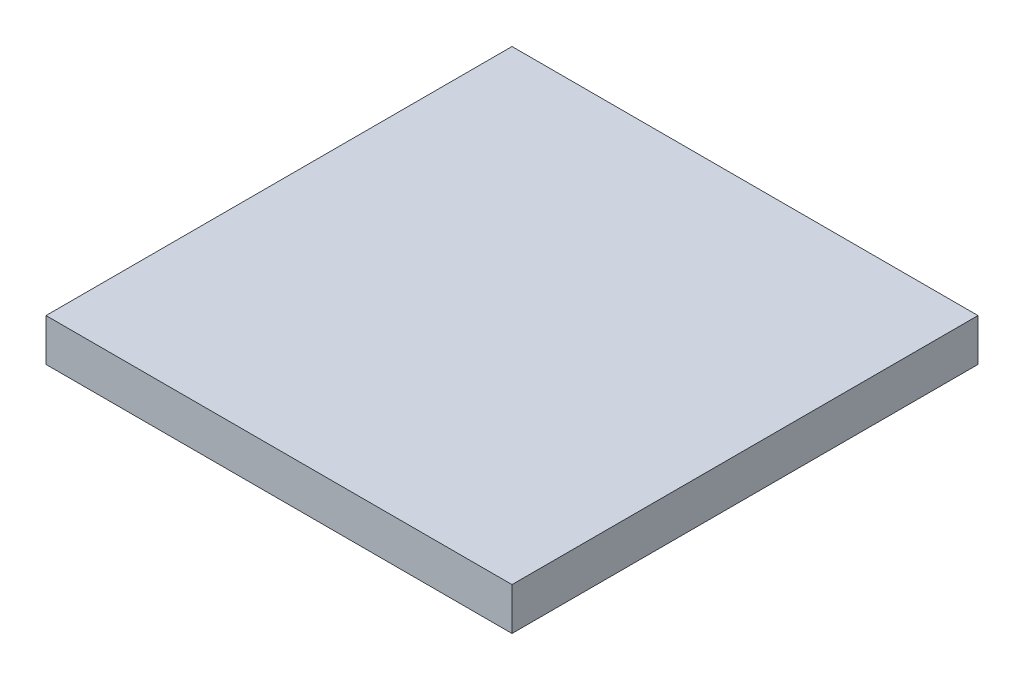
ISO-10303-21;
HEADER;
FILE_DESCRIPTION(('STEP AP214'),'2;1');
FILE_NAME('part.step','',(''),(''),'','','');
FILE_SCHEMA(('AUTOMOTIVE_DESIGN { 1 0 10303 214 1 1 1 1 }'));
ENDSEC;
DATA;
#1=APPLICATION_CONTEXT('core data for automotive mechanical design processes');
#2=APPLICATION_PROTOCOL_DEFINITION('international standard','automotive_design',2000,#1);
#3=PRODUCT_CONTEXT('',#1,'mechanical');
#4=PRODUCT('Part','Part','',(#3));
#5=PRODUCT_RELATED_PRODUCT_CATEGORY('part','',(#4));
#6=PRODUCT_DEFINITION_FORMATION('','',#4);
#7=PRODUCT_DEFINITION_CONTEXT('part definition',#1,'design');
#8=PRODUCT_DEFINITION('design','',#6,#7);
#9=PRODUCT_DEFINITION_SHAPE('','',#8);
#10=(LENGTH_UNIT() NAMED_UNIT(*) SI_UNIT(.MILLI.,.METRE.));
#11=(NAMED_UNIT(*) PLANE_ANGLE_UNIT() SI_UNIT($,.RADIAN.));
#12=(NAMED_UNIT(*) SI_UNIT($,.STERADIAN.) SOLID_ANGLE_UNIT());
#13=UNCERTAINTY_MEASURE_WITH_UNIT(LENGTH_MEASURE(1.E-05),#10,'distance_accuracy_value','');
#14=(GEOMETRIC_REPRESENTATION_CONTEXT(3) GLOBAL_UNCERTAINTY_ASSIGNED_CONTEXT((#13)) GLOBAL_UNIT_ASSIGNED_CONTEXT((#10,
#11,#12)) REPRESENTATION_CONTEXT('',''));
#15=CARTESIAN_POINT('',(0.,0.,0.));
#16=DIRECTION('',(0.,0.,1.));
#17=DIRECTION('',(1.,0.,0.));
#18=AXIS2_PLACEMENT_3D('',#15,#16,#17);
#19=CARTESIAN_POINT('',(0.,-1.,0.));
#20=DIRECTION('',(0.,1.,0.));
#21=DIRECTION('',(0.,0.,1.));
#22=AXIS2_PLACEMENT_3D('',#19,#20,#21);
#23=PLANE('',#22);
#24=DIRECTION('',(0.,0.,-1.));
#25=VECTOR('',#24,1.);
#26=CARTESIAN_POINT('',(11.,-1.,-11.));
#27=LINE('',#26,#25);
#28=CARTESIAN_POINT('',(11.,-1.,11.));
#29=VERTEX_POINT('',#28);
#30=CARTESIAN_POINT('',(11.,-1.,-11.));
#31=VERTEX_POINT('',#30);
#32=EDGE_CURVE('E143',#29,#31,#27,.T.);
#33=ORIENTED_EDGE('',*,*,#32,.F.);
#34=DIRECTION('',(1.,0.,0.));
#35=VECTOR('',#34,1.);
#36=CARTESIAN_POINT('',(-11.,-1.,11.));
#37=LINE('',#36,#35);
#38=CARTESIAN_POINT('',(-11.,-1.,11.));
#39=VERTEX_POINT('',#38);
#40=EDGE_CURVE('E156',#39,#29,#37,.T.);
#41=ORIENTED_EDGE('',*,*,#40,.F.);
#42=DIRECTION('',(0.,0.,1.));
#43=VECTOR('',#42,1.);
#44=CARTESIAN_POINT('',(-11.,-1.,-11.));
#45=LINE('',#44,#43);
#46=CARTESIAN_POINT('',(-11.,-1.,-11.));
#47=VERTEX_POINT('',#46);
#48=EDGE_CURVE('E164',#47,#39,#45,.T.);
#49=ORIENTED_EDGE('',*,*,#48,.F.);
#50=DIRECTION('',(-1.,0.,0.));
#51=VECTOR('',#50,1.);
#52=CARTESIAN_POINT('',(-11.,-1.,-11.));
#53=LINE('',#52,#51);
#54=EDGE_CURVE('E146',#31,#47,#53,.T.);
#55=ORIENTED_EDGE('',*,*,#54,.F.);
#56=EDGE_LOOP('',(#33,#41,#49,#55));
#57=FACE_BOUND('',#56,.T.);
#58=DIRECTION('',(-1.,0.,0.));
#59=VECTOR('',#58,1.);
#60=CARTESIAN_POINT('',(7.25,-1.,8.75));
#61=LINE('',#60,#59);
#62=CARTESIAN_POINT('',(8.75,-1.,8.75));
#63=VERTEX_POINT('',#62);
#64=CARTESIAN_POINT('',(7.25,-1.,8.75));
#65=VERTEX_POINT('',#64);
#66=EDGE_CURVE('E142',#63,#65,#61,.T.);
#67=ORIENTED_EDGE('',*,*,#66,.F.);
#68=DIRECTION('',(0.,0.,1.));
#69=VECTOR('',#68,1.);
#70=CARTESIAN_POINT('',(8.75,-1.,-8.75));
#71=LINE('',#70,#69);
#72=CARTESIAN_POINT('',(8.75,-1.,-8.74999999999999));
#73=VERTEX_POINT('',#72);
#74=EDGE_CURVE('E139',#73,#63,#71,.T.);
#75=ORIENTED_EDGE('',*,*,#74,.F.);
#76=DIRECTION('',(1.,0.,0.));
#77=VECTOR('',#76,1.);
#78=CARTESIAN_POINT('',(-8.75,-1.,-8.75));
#79=LINE('',#78,#77);
#80=CARTESIAN_POINT('',(-8.75,-1.,-8.75));
#81=VERTEX_POINT('',#80);
#82=EDGE_CURVE('E337',#81,#73,#79,.T.);
#83=ORIENTED_EDGE('',*,*,#82,.F.);
#84=DIRECTION('',(0.,0.,-1.));
#85=VECTOR('',#84,1.);
#86=CARTESIAN_POINT('',(-8.75,-1.,-8.75));
#87=LINE('',#86,#85);
#88=CARTESIAN_POINT('',(-8.75,-1.,8.75));
#89=VERTEX_POINT('',#88);
#90=EDGE_CURVE('E368',#89,#81,#87,.T.);
#91=ORIENTED_EDGE('',*,*,#90,.F.);
#92=DIRECTION('',(-1.,0.,0.));
#93=VECTOR('',#92,1.);
#94=CARTESIAN_POINT('',(-8.75,-1.,8.75));
#95=LINE('',#94,#93);
#96=CARTESIAN_POINT('',(-7.25,-1.,8.75));
#97=VERTEX_POINT('',#96);
#98=EDGE_CURVE('E361',#97,#89,#95,.T.);
#99=ORIENTED_EDGE('',*,*,#98,.F.);
#100=DIRECTION('',(0.,0.,1.));
#101=VECTOR('',#100,1.);
#102=CARTESIAN_POINT('',(-7.25,-1.,7.25));
#103=LINE('',#102,#101);
#104=CARTESIAN_POINT('',(-7.24999999999999,-1.,-7.25));
#105=VERTEX_POINT('',#104);
#106=EDGE_CURVE('E358',#105,#97,#103,.T.);
#107=ORIENTED_EDGE('',*,*,#106,.F.);
#108=DIRECTION('',(-1.,0.,0.));
#109=VECTOR('',#108,1.);
#110=CARTESIAN_POINT('',(-7.25,-1.,-7.25));
#111=LINE('',#110,#109);
#112=CARTESIAN_POINT('',(7.25,-1.,-7.25));
#113=VERTEX_POINT('',#112);
#114=EDGE_CURVE('E53',#113,#105,#111,.T.);
#115=ORIENTED_EDGE('',*,*,#114,.F.);
#116=DIRECTION('',(0.,0.,-1.));
#117=VECTOR('',#116,1.);
#118=CARTESIAN_POINT('',(7.25,-1.,-7.25));
#119=LINE('',#118,#117);
#120=EDGE_CURVE('E48',#65,#113,#119,.T.);
#121=ORIENTED_EDGE('',*,*,#120,.F.);
#122=EDGE_LOOP('',(#67,#75,#83,#91,#99,#107,#115,#121));
#123=FACE_BOUND('',#122,.T.);
#124=ADVANCED_FACE('F33',(#57,#123),#23,.F.);
#125=CARTESIAN_POINT('',(11.,1.,-11.));
#126=DIRECTION('',(-1.,0.,0.));
#127=DIRECTION('',(0.,0.,1.));
#128=AXIS2_PLACEMENT_3D('',#125,#126,#127);
#129=PLANE('',#128);
#130=ORIENTED_EDGE('',*,*,#32,.T.);
#131=DIRECTION('',(0.,-1.,0.));
#132=VECTOR('',#131,1.);
#133=CARTESIAN_POINT('',(11.,1.,-11.));
#134=LINE('',#133,#132);
#135=CARTESIAN_POINT('',(11.,1.,-11.));
#136=VERTEX_POINT('',#135);
#137=EDGE_CURVE('E11',#136,#31,#134,.T.);
#138=ORIENTED_EDGE('',*,*,#137,.F.);
#139=DIRECTION('',(0.,0.,-1.));
#140=VECTOR('',#139,1.);
#141=CARTESIAN_POINT('',(11.,1.,-11.));
#142=LINE('',#141,#140);
#143=CARTESIAN_POINT('',(11.,1.,11.));
#144=VERTEX_POINT('',#143);
#145=EDGE_CURVE('E152',#144,#136,#142,.T.);
#146=ORIENTED_EDGE('',*,*,#145,.F.);
#147=DIRECTION('',(0.,-1.,0.));
#148=VECTOR('',#147,1.);
#149=CARTESIAN_POINT('',(11.,1.,11.));
#150=LINE('',#149,#148);
#151=EDGE_CURVE('E161',#144,#29,#150,.T.);
#152=ORIENTED_EDGE('',*,*,#151,.T.);
#153=EDGE_LOOP('',(#130,#138,#146,#152));
#154=FACE_BOUND('',#153,.T.);
#155=ADVANCED_FACE('F35',(#154),#129,.F.);
#156=CARTESIAN_POINT('',(-11.,1.,-11.));
#157=DIRECTION('',(0.,0.,1.));
#158=DIRECTION('',(1.,0.,0.));
#159=AXIS2_PLACEMENT_3D('',#156,#157,#158);
#160=PLANE('',#159);
#161=ORIENTED_EDGE('',*,*,#54,.T.);
#162=DIRECTION('',(0.,-1.,0.));
#163=VECTOR('',#162,1.);
#164=CARTESIAN_POINT('',(-11.,1.,-11.));
#165=LINE('',#164,#163);
#166=CARTESIAN_POINT('',(-11.,1.,-11.));
#167=VERTEX_POINT('',#166);
#168=EDGE_CURVE('E41',#167,#47,#165,.T.);
#169=ORIENTED_EDGE('',*,*,#168,.F.);
#170=DIRECTION('',(-1.,0.,0.));
#171=VECTOR('',#170,1.);
#172=CARTESIAN_POINT('',(-11.,1.,-11.));
#173=LINE('',#172,#171);
#174=EDGE_CURVE('E155',#136,#167,#173,.T.);
#175=ORIENTED_EDGE('',*,*,#174,.F.);
#176=ORIENTED_EDGE('',*,*,#137,.T.);
#177=EDGE_LOOP('',(#161,#169,#175,#176));
#178=FACE_BOUND('',#177,.T.);
#179=ADVANCED_FACE('F191',(#178),#160,.F.);
#180=CARTESIAN_POINT('',(-11.,1.,-11.));
#181=DIRECTION('',(1.,0.,0.));
#182=DIRECTION('',(0.,0.,-1.));
#183=AXIS2_PLACEMENT_3D('',#180,#181,#182);
#184=PLANE('',#183);
#185=ORIENTED_EDGE('',*,*,#48,.T.);
#186=DIRECTION('',(0.,-1.,0.));
#187=VECTOR('',#186,1.);
#188=CARTESIAN_POINT('',(-11.,1.,11.));
#189=LINE('',#188,#187);
#190=CARTESIAN_POINT('',(-11.,1.,11.));
#191=VERTEX_POINT('',#190);
#192=EDGE_CURVE('E169',#191,#39,#189,.T.);
#193=ORIENTED_EDGE('',*,*,#192,.F.);
#194=DIRECTION('',(0.,0.,1.));
#195=VECTOR('',#194,1.);
#196=CARTESIAN_POINT('',(-11.,1.,-11.));
#197=LINE('',#196,#195);
#198=EDGE_CURVE('E158',#167,#191,#197,.T.);
#199=ORIENTED_EDGE('',*,*,#198,.F.);
#200=ORIENTED_EDGE('',*,*,#168,.T.);
#201=EDGE_LOOP('',(#185,#193,#199,#200));
#202=FACE_BOUND('',#201,.T.);
#203=ADVANCED_FACE('F176',(#202),#184,.F.);
#204=CARTESIAN_POINT('',(-11.,1.,11.));
#205=DIRECTION('',(0.,0.,-1.));
#206=DIRECTION('',(-1.,0.,0.));
#207=AXIS2_PLACEMENT_3D('',#204,#205,#206);
#208=PLANE('',#207);
#209=ORIENTED_EDGE('',*,*,#40,.T.);
#210=ORIENTED_EDGE('',*,*,#151,.F.);
#211=DIRECTION('',(1.,0.,0.));
#212=VECTOR('',#211,1.);
#213=CARTESIAN_POINT('',(-11.,1.,11.));
#214=LINE('',#213,#212);
#215=EDGE_CURVE('E160',#191,#144,#214,.T.);
#216=ORIENTED_EDGE('',*,*,#215,.F.);
#217=ORIENTED_EDGE('',*,*,#192,.T.);
#218=EDGE_LOOP('',(#209,#210,#216,#217));
#219=FACE_BOUND('',#218,.T.);
#220=ADVANCED_FACE('F184',(#219),#208,.F.);
#221=CARTESIAN_POINT('',(0.,1.,0.));
#222=DIRECTION('',(0.,1.,0.));
#223=DIRECTION('',(0.,0.,1.));
#224=AXIS2_PLACEMENT_3D('',#221,#222,#223);
#225=PLANE('',#224);
#226=ORIENTED_EDGE('',*,*,#145,.T.);
#227=ORIENTED_EDGE('',*,*,#174,.T.);
#228=ORIENTED_EDGE('',*,*,#198,.T.);
#229=ORIENTED_EDGE('',*,*,#215,.T.);
#230=EDGE_LOOP('',(#226,#227,#228,#229));
#231=FACE_BOUND('',#230,.T.);
#232=ADVANCED_FACE('F190',(#231),#225,.T.);
#233=CARTESIAN_POINT('',(7.25,-3.,8.75));
#234=DIRECTION('',(0.,0.,-1.));
#235=DIRECTION('',(-1.,0.,0.));
#236=AXIS2_PLACEMENT_3D('',#233,#234,#235);
#237=PLANE('',#236);
#238=ORIENTED_EDGE('',*,*,#66,.T.);
#239=DIRECTION('',(0.,1.,0.));
#240=VECTOR('',#239,1.);
#241=CARTESIAN_POINT('',(7.25,-3.,8.75));
#242=LINE('',#241,#240);
#243=CARTESIAN_POINT('',(7.25,-3.,8.75));
#244=VERTEX_POINT('',#243);
#245=EDGE_CURVE('E123',#244,#65,#242,.T.);
#246=ORIENTED_EDGE('',*,*,#245,.F.);
#247=DIRECTION('',(-1.,0.,0.));
#248=VECTOR('',#247,1.);
#249=CARTESIAN_POINT('',(7.25,-3.,8.75));
#250=LINE('',#249,#248);
#251=CARTESIAN_POINT('',(8.75,-3.,8.75));
#252=VERTEX_POINT('',#251);
#253=EDGE_CURVE('E130',#252,#244,#250,.T.);
#254=ORIENTED_EDGE('',*,*,#253,.F.);
#255=DIRECTION('',(0.,1.,0.));
#256=VECTOR('',#255,1.);
#257=CARTESIAN_POINT('',(8.75,-3.,8.75));
#258=LINE('',#257,#256);
#259=EDGE_CURVE('E333',#252,#63,#258,.T.);
#260=ORIENTED_EDGE('',*,*,#259,.T.);
#261=EDGE_LOOP('',(#238,#246,#254,#260));
#262=FACE_BOUND('',#261,.T.);
#263=ADVANCED_FACE('F141',(#262),#237,.F.);
#264=CARTESIAN_POINT('',(7.25,-3.,-7.25));
#265=DIRECTION('',(1.,0.,0.));
#266=DIRECTION('',(0.,0.,-1.));
#267=AXIS2_PLACEMENT_3D('',#264,#265,#266);
#268=PLANE('',#267);
#269=ORIENTED_EDGE('',*,*,#120,.T.);
#270=DIRECTION('',(0.,1.,0.));
#271=VECTOR('',#270,1.);
#272=CARTESIAN_POINT('',(7.25,-3.,-7.25));
#273=LINE('',#272,#271);
#274=CARTESIAN_POINT('',(7.25,-3.,-7.25));
#275=VERTEX_POINT('',#274);
#276=EDGE_CURVE('E126',#275,#113,#273,.T.);
#277=ORIENTED_EDGE('',*,*,#276,.F.);
#278=DIRECTION('',(0.,0.,-1.));
#279=VECTOR('',#278,1.);
#280=CARTESIAN_POINT('',(7.25,-3.,7.25));
#281=LINE('',#280,#279);
#282=EDGE_CURVE('E119',#244,#275,#281,.T.);
#283=ORIENTED_EDGE('',*,*,#282,.F.);
#284=ORIENTED_EDGE('',*,*,#245,.T.);
#285=EDGE_LOOP('',(#269,#277,#283,#284));
#286=FACE_BOUND('',#285,.T.);
#287=ADVANCED_FACE('F121',(#286),#268,.F.);
#288=CARTESIAN_POINT('',(-7.25,-3.,-7.25));
#289=DIRECTION('',(0.,0.,-1.));
#290=DIRECTION('',(-1.,0.,0.));
#291=AXIS2_PLACEMENT_3D('',#288,#289,#290);
#292=PLANE('',#291);
#293=ORIENTED_EDGE('',*,*,#114,.T.);
#294=DIRECTION('',(0.,1.,0.));
#295=VECTOR('',#294,1.);
#296=CARTESIAN_POINT('',(-7.25,-3.,-7.25));
#297=LINE('',#296,#295);
#298=CARTESIAN_POINT('',(-7.25,-3.,-7.25));
#299=VERTEX_POINT('',#298);
#300=EDGE_CURVE('E148',#299,#105,#297,.T.);
#301=ORIENTED_EDGE('',*,*,#300,.F.);
#302=DIRECTION('',(-1.,0.,0.));
#303=VECTOR('',#302,1.);
#304=CARTESIAN_POINT('',(-7.25,-3.,-7.25));
#305=LINE('',#304,#303);
#306=EDGE_CURVE('E129',#275,#299,#305,.T.);
#307=ORIENTED_EDGE('',*,*,#306,.F.);
#308=ORIENTED_EDGE('',*,*,#276,.T.);
#309=EDGE_LOOP('',(#293,#301,#307,#308));
#310=FACE_BOUND('',#309,.T.);
#311=ADVANCED_FACE('F215',(#310),#292,.F.);
#312=CARTESIAN_POINT('',(-7.25,-3.,7.25));
#313=DIRECTION('',(-1.,0.,0.));
#314=DIRECTION('',(0.,0.,1.));
#315=AXIS2_PLACEMENT_3D('',#312,#313,#314);
#316=PLANE('',#315);
#317=ORIENTED_EDGE('',*,*,#106,.T.);
#318=DIRECTION('',(0.,1.,0.));
#319=VECTOR('',#318,1.);
#320=CARTESIAN_POINT('',(-7.25,-3.,8.75));
#321=LINE('',#320,#319);
#322=CARTESIAN_POINT('',(-7.25,-3.,8.75));
#323=VERTEX_POINT('',#322);
#324=EDGE_CURVE('E351',#323,#97,#321,.T.);
#325=ORIENTED_EDGE('',*,*,#324,.F.);
#326=DIRECTION('',(0.,0.,1.));
#327=VECTOR('',#326,1.);
#328=CARTESIAN_POINT('',(-7.25,-3.,-7.25));
#329=LINE('',#328,#327);
#330=EDGE_CURVE('E359',#299,#323,#329,.T.);
#331=ORIENTED_EDGE('',*,*,#330,.F.);
#332=ORIENTED_EDGE('',*,*,#300,.T.);
#333=EDGE_LOOP('',(#317,#325,#331,#332));
#334=FACE_BOUND('',#333,.T.);
#335=ADVANCED_FACE('F220',(#334),#316,.F.);
#336=CARTESIAN_POINT('',(-8.75,-3.,8.75));
#337=DIRECTION('',(0.,0.,-1.));
#338=DIRECTION('',(-1.,0.,0.));
#339=AXIS2_PLACEMENT_3D('',#336,#337,#338);
#340=PLANE('',#339);
#341=ORIENTED_EDGE('',*,*,#98,.T.);
#342=DIRECTION('',(0.,1.,0.));
#343=VECTOR('',#342,1.);
#344=CARTESIAN_POINT('',(-8.75,-3.,8.75));
#345=LINE('',#344,#343);
#346=CARTESIAN_POINT('',(-8.75,-3.,8.75));
#347=VERTEX_POINT('',#346);
#348=EDGE_CURVE('E348',#347,#89,#345,.T.);
#349=ORIENTED_EDGE('',*,*,#348,.F.);
#350=DIRECTION('',(-1.,0.,0.));
#351=VECTOR('',#350,1.);
#352=CARTESIAN_POINT('',(-8.75,-3.,8.75));
#353=LINE('',#352,#351);
#354=EDGE_CURVE('E376',#323,#347,#353,.T.);
#355=ORIENTED_EDGE('',*,*,#354,.F.);
#356=ORIENTED_EDGE('',*,*,#324,.T.);
#357=EDGE_LOOP('',(#341,#349,#355,#356));
#358=FACE_BOUND('',#357,.T.);
#359=ADVANCED_FACE('F224',(#358),#340,.F.);
#360=CARTESIAN_POINT('',(-8.75,-3.,-8.75));
#361=DIRECTION('',(1.,0.,0.));
#362=DIRECTION('',(0.,0.,-1.));
#363=AXIS2_PLACEMENT_3D('',#360,#361,#362);
#364=PLANE('',#363);
#365=ORIENTED_EDGE('',*,*,#90,.T.);
#366=DIRECTION('',(0.,1.,0.));
#367=VECTOR('',#366,1.);
#368=CARTESIAN_POINT('',(-8.75,-3.,-8.75));
#369=LINE('',#368,#367);
#370=CARTESIAN_POINT('',(-8.75,-3.,-8.75));
#371=VERTEX_POINT('',#370);
#372=EDGE_CURVE('E340',#371,#81,#369,.T.);
#373=ORIENTED_EDGE('',*,*,#372,.F.);
#374=DIRECTION('',(0.,0.,-1.));
#375=VECTOR('',#374,1.);
#376=CARTESIAN_POINT('',(-8.75,-3.,-8.75));
#377=LINE('',#376,#375);
#378=EDGE_CURVE('E374',#347,#371,#377,.T.);
#379=ORIENTED_EDGE('',*,*,#378,.F.);
#380=ORIENTED_EDGE('',*,*,#348,.T.);
#381=EDGE_LOOP('',(#365,#373,#379,#380));
#382=FACE_BOUND('',#381,.T.);
#383=ADVANCED_FACE('F228',(#382),#364,.F.);
#384=CARTESIAN_POINT('',(-8.75,-3.,-8.75));
#385=DIRECTION('',(0.,0.,1.));
#386=DIRECTION('',(1.,0.,0.));
#387=AXIS2_PLACEMENT_3D('',#384,#385,#386);
#388=PLANE('',#387);
#389=ORIENTED_EDGE('',*,*,#82,.T.);
#390=DIRECTION('',(0.,1.,0.));
#391=VECTOR('',#390,1.);
#392=CARTESIAN_POINT('',(8.75,-3.,-8.75));
#393=LINE('',#392,#391);
#394=CARTESIAN_POINT('',(8.75,-3.,-8.75));
#395=VERTEX_POINT('',#394);
#396=EDGE_CURVE('E335',#395,#73,#393,.T.);
#397=ORIENTED_EDGE('',*,*,#396,.F.);
#398=DIRECTION('',(1.,0.,0.));
#399=VECTOR('',#398,1.);
#400=CARTESIAN_POINT('',(-8.75,-3.,-8.75));
#401=LINE('',#400,#399);
#402=EDGE_CURVE('E342',#371,#395,#401,.T.);
#403=ORIENTED_EDGE('',*,*,#402,.F.);
#404=ORIENTED_EDGE('',*,*,#372,.T.);
#405=EDGE_LOOP('',(#389,#397,#403,#404));
#406=FACE_BOUND('',#405,.T.);
#407=ADVANCED_FACE('F232',(#406),#388,.F.);
#408=CARTESIAN_POINT('',(8.75,-3.,-8.75));
#409=DIRECTION('',(-1.,0.,0.));
#410=DIRECTION('',(0.,0.,1.));
#411=AXIS2_PLACEMENT_3D('',#408,#409,#410);
#412=PLANE('',#411);
#413=ORIENTED_EDGE('',*,*,#74,.T.);
#414=ORIENTED_EDGE('',*,*,#259,.F.);
#415=DIRECTION('',(0.,0.,1.));
#416=VECTOR('',#415,1.);
#417=CARTESIAN_POINT('',(8.75,-3.,-8.75));
#418=LINE('',#417,#416);
#419=EDGE_CURVE('E135',#395,#252,#418,.T.);
#420=ORIENTED_EDGE('',*,*,#419,.F.);
#421=ORIENTED_EDGE('',*,*,#396,.T.);
#422=EDGE_LOOP('',(#413,#414,#420,#421));
#423=FACE_BOUND('',#422,.T.);
#424=ADVANCED_FACE('F236',(#423),#412,.F.);
#425=CARTESIAN_POINT('',(0.,-3.,0.));
#426=DIRECTION('',(0.,-1.,0.));
#427=DIRECTION('',(0.,0.,-1.));
#428=AXIS2_PLACEMENT_3D('',#425,#426,#427);
#429=PLANE('',#428);
#430=ORIENTED_EDGE('',*,*,#253,.T.);
#431=ORIENTED_EDGE('',*,*,#282,.T.);
#432=ORIENTED_EDGE('',*,*,#306,.T.);
#433=ORIENTED_EDGE('',*,*,#330,.T.);
#434=ORIENTED_EDGE('',*,*,#354,.T.);
#435=ORIENTED_EDGE('',*,*,#378,.T.);
#436=ORIENTED_EDGE('',*,*,#402,.T.);
#437=ORIENTED_EDGE('',*,*,#419,.T.);
#438=EDGE_LOOP('',(#430,#431,#432,#433,#434,#435,#436,#437));
#439=FACE_BOUND('',#438,.T.);
#440=ADVANCED_FACE('F133',(#439),#429,.T.);
#441=CLOSED_SHELL('',(#124,#155,#179,#203,#220,#232,#263,#287,#311,#335,#359,#383,#407,#424,#440));
#442=MANIFOLD_SOLID_BREP('B2',#441);
#443=ADVANCED_BREP_SHAPE_REPRESENTATION('',(#18,#442),#14);
#444=SHAPE_DEFINITION_REPRESENTATION(#9,#443);
ENDSEC;
END-ISO-10303-21;
